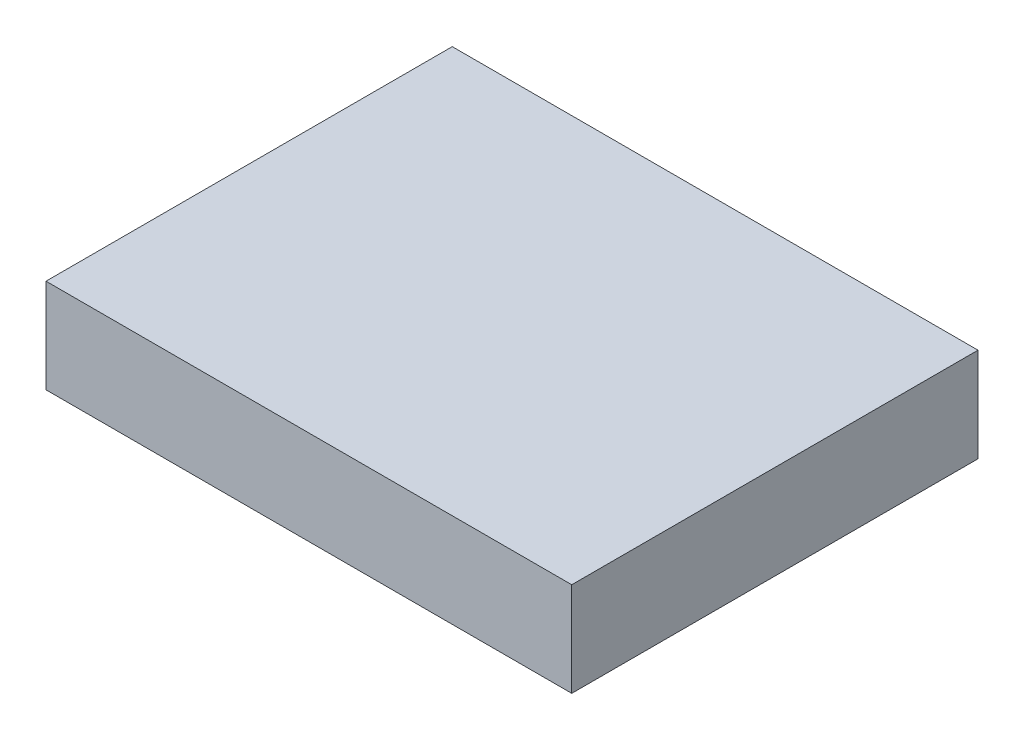
ISO-10303-21;
HEADER;
FILE_DESCRIPTION(('STEP AP214'),'2;1');
FILE_NAME('part.step','',(''),(''),'','','');
FILE_SCHEMA(('AUTOMOTIVE_DESIGN { 1 0 10303 214 1 1 1 1 }'));
ENDSEC;
DATA;
#1=APPLICATION_CONTEXT('core data for automotive mechanical design processes');
#2=APPLICATION_PROTOCOL_DEFINITION('international standard','automotive_design',2000,#1);
#3=PRODUCT_CONTEXT('',#1,'mechanical');
#4=PRODUCT('Part','Part','',(#3));
#5=PRODUCT_RELATED_PRODUCT_CATEGORY('part','',(#4));
#6=PRODUCT_DEFINITION_FORMATION('','',#4);
#7=PRODUCT_DEFINITION_CONTEXT('part definition',#1,'design');
#8=PRODUCT_DEFINITION('design','',#6,#7);
#9=PRODUCT_DEFINITION_SHAPE('','',#8);
#10=(LENGTH_UNIT() NAMED_UNIT(*) SI_UNIT(.MILLI.,.METRE.));
#11=(NAMED_UNIT(*) PLANE_ANGLE_UNIT() SI_UNIT($,.RADIAN.));
#12=(NAMED_UNIT(*) SI_UNIT($,.STERADIAN.) SOLID_ANGLE_UNIT());
#13=UNCERTAINTY_MEASURE_WITH_UNIT(LENGTH_MEASURE(1.E-05),#10,'distance_accuracy_value','');
#14=(GEOMETRIC_REPRESENTATION_CONTEXT(3) GLOBAL_UNCERTAINTY_ASSIGNED_CONTEXT((#13)) GLOBAL_UNIT_ASSIGNED_CONTEXT((#10,
#11,#12)) REPRESENTATION_CONTEXT('',''));
#15=CARTESIAN_POINT('',(0.,0.,0.));
#16=DIRECTION('',(0.,0.,1.));
#17=DIRECTION('',(1.,0.,0.));
#18=AXIS2_PLACEMENT_3D('',#15,#16,#17);
#19=CARTESIAN_POINT('',(139.7,50.,107.95));
#20=DIRECTION('',(-1.,0.,0.));
#21=DIRECTION('',(0.,0.,1.));
#22=AXIS2_PLACEMENT_3D('',#19,#20,#21);
#23=PLANE('',#22);
#24=DIRECTION('',(0.,0.,-1.));
#25=VECTOR('',#24,1.);
#26=CARTESIAN_POINT('',(139.7,0.,107.95));
#27=LINE('',#26,#25);
#28=CARTESIAN_POINT('',(139.7,0.,107.95));
#29=VERTEX_POINT('',#28);
#30=CARTESIAN_POINT('',(139.7,0.,-107.95));
#31=VERTEX_POINT('',#30);
#32=EDGE_CURVE('E99',#29,#31,#27,.T.);
#33=ORIENTED_EDGE('',*,*,#32,.T.);
#34=DIRECTION('',(0.,-1.,0.));
#35=VECTOR('',#34,1.);
#36=CARTESIAN_POINT('',(139.7,50.,-107.95));
#37=LINE('',#36,#35);
#38=CARTESIAN_POINT('',(139.7,50.,-107.95));
#39=VERTEX_POINT('',#38);
#40=EDGE_CURVE('E11',#39,#31,#37,.T.);
#41=ORIENTED_EDGE('',*,*,#40,.F.);
#42=DIRECTION('',(0.,0.,-1.));
#43=VECTOR('',#42,1.);
#44=CARTESIAN_POINT('',(139.7,50.,107.95));
#45=LINE('',#44,#43);
#46=CARTESIAN_POINT('',(139.7,50.,107.95));
#47=VERTEX_POINT('',#46);
#48=EDGE_CURVE('E87',#47,#39,#45,.T.);
#49=ORIENTED_EDGE('',*,*,#48,.F.);
#50=DIRECTION('',(0.,-1.,0.));
#51=VECTOR('',#50,1.);
#52=CARTESIAN_POINT('',(139.7,50.,107.95));
#53=LINE('',#52,#51);
#54=EDGE_CURVE('E95',#47,#29,#53,.T.);
#55=ORIENTED_EDGE('',*,*,#54,.T.);
#56=EDGE_LOOP('',(#33,#41,#49,#55));
#57=FACE_BOUND('',#56,.T.);
#58=ADVANCED_FACE('F36',(#57),#23,.F.);
#59=CARTESIAN_POINT('',(-139.7,50.,-107.95));
#60=DIRECTION('',(0.,0.,1.));
#61=DIRECTION('',(1.,0.,0.));
#62=AXIS2_PLACEMENT_3D('',#59,#60,#61);
#63=PLANE('',#62);
#64=DIRECTION('',(-1.,0.,0.));
#65=VECTOR('',#64,1.);
#66=CARTESIAN_POINT('',(-139.7,0.,-107.95));
#67=LINE('',#66,#65);
#68=CARTESIAN_POINT('',(-139.7,0.,-107.95));
#69=VERTEX_POINT('',#68);
#70=EDGE_CURVE('E91',#31,#69,#67,.T.);
#71=ORIENTED_EDGE('',*,*,#70,.T.);
#72=DIRECTION('',(0.,-1.,0.));
#73=VECTOR('',#72,1.);
#74=CARTESIAN_POINT('',(-139.7,50.,-107.95));
#75=LINE('',#74,#73);
#76=CARTESIAN_POINT('',(-139.7,50.,-107.95));
#77=VERTEX_POINT('',#76);
#78=EDGE_CURVE('E44',#77,#69,#75,.T.);
#79=ORIENTED_EDGE('',*,*,#78,.F.);
#80=DIRECTION('',(-1.,0.,0.));
#81=VECTOR('',#80,1.);
#82=CARTESIAN_POINT('',(-139.7,50.,-107.95));
#83=LINE('',#82,#81);
#84=EDGE_CURVE('E82',#39,#77,#83,.T.);
#85=ORIENTED_EDGE('',*,*,#84,.F.);
#86=ORIENTED_EDGE('',*,*,#40,.T.);
#87=EDGE_LOOP('',(#71,#79,#85,#86));
#88=FACE_BOUND('',#87,.T.);
#89=ADVANCED_FACE('F90',(#88),#63,.F.);
#90=CARTESIAN_POINT('',(-139.7,50.,107.95));
#91=DIRECTION('',(1.,0.,0.));
#92=DIRECTION('',(0.,0.,-1.));
#93=AXIS2_PLACEMENT_3D('',#90,#91,#92);
#94=PLANE('',#93);
#95=DIRECTION('',(0.,0.,1.));
#96=VECTOR('',#95,1.);
#97=CARTESIAN_POINT('',(-139.7,0.,107.95));
#98=LINE('',#97,#96);
#99=CARTESIAN_POINT('',(-139.7,0.,107.95));
#100=VERTEX_POINT('',#99);
#101=EDGE_CURVE('E69',#69,#100,#98,.T.);
#102=ORIENTED_EDGE('',*,*,#101,.T.);
#103=DIRECTION('',(0.,-1.,0.));
#104=VECTOR('',#103,1.);
#105=CARTESIAN_POINT('',(-139.7,50.,107.95));
#106=LINE('',#105,#104);
#107=CARTESIAN_POINT('',(-139.7,50.,107.95));
#108=VERTEX_POINT('',#107);
#109=EDGE_CURVE('E92',#108,#100,#106,.T.);
#110=ORIENTED_EDGE('',*,*,#109,.F.);
#111=DIRECTION('',(0.,0.,1.));
#112=VECTOR('',#111,1.);
#113=CARTESIAN_POINT('',(-139.7,50.,107.95));
#114=LINE('',#113,#112);
#115=EDGE_CURVE('E85',#77,#108,#114,.T.);
#116=ORIENTED_EDGE('',*,*,#115,.F.);
#117=ORIENTED_EDGE('',*,*,#78,.T.);
#118=EDGE_LOOP('',(#102,#110,#116,#117));
#119=FACE_BOUND('',#118,.T.);
#120=ADVANCED_FACE('F93',(#119),#94,.F.);
#121=CARTESIAN_POINT('',(-139.7,50.,107.95));
#122=DIRECTION('',(0.,0.,-1.));
#123=DIRECTION('',(-1.,0.,0.));
#124=AXIS2_PLACEMENT_3D('',#121,#122,#123);
#125=PLANE('',#124);
#126=DIRECTION('',(1.,0.,0.));
#127=VECTOR('',#126,1.);
#128=CARTESIAN_POINT('',(-139.7,0.,107.95));
#129=LINE('',#128,#127);
#130=EDGE_CURVE('E75',#100,#29,#129,.T.);
#131=ORIENTED_EDGE('',*,*,#130,.T.);
#132=ORIENTED_EDGE('',*,*,#54,.F.);
#133=DIRECTION('',(1.,0.,0.));
#134=VECTOR('',#133,1.);
#135=CARTESIAN_POINT('',(-139.7,50.,107.95));
#136=LINE('',#135,#134);
#137=EDGE_CURVE('E52',#108,#47,#136,.T.);
#138=ORIENTED_EDGE('',*,*,#137,.F.);
#139=ORIENTED_EDGE('',*,*,#109,.T.);
#140=EDGE_LOOP('',(#131,#132,#138,#139));
#141=FACE_BOUND('',#140,.T.);
#142=ADVANCED_FACE('F106',(#141),#125,.F.);
#143=CARTESIAN_POINT('',(0.,50.,0.));
#144=DIRECTION('',(0.,-1.,0.));
#145=DIRECTION('',(0.,0.,-1.));
#146=AXIS2_PLACEMENT_3D('',#143,#144,#145);
#147=PLANE('',#146);
#148=ORIENTED_EDGE('',*,*,#48,.T.);
#149=ORIENTED_EDGE('',*,*,#84,.T.);
#150=ORIENTED_EDGE('',*,*,#115,.T.);
#151=ORIENTED_EDGE('',*,*,#137,.T.);
#152=EDGE_LOOP('',(#148,#149,#150,#151));
#153=FACE_BOUND('',#152,.T.);
#154=ADVANCED_FACE('F83',(#153),#147,.F.);
#155=CARTESIAN_POINT('',(0.,0.,0.));
#156=DIRECTION('',(0.,-1.,0.));
#157=DIRECTION('',(0.,0.,-1.));
#158=AXIS2_PLACEMENT_3D('',#155,#156,#157);
#159=PLANE('',#158);
#160=ORIENTED_EDGE('',*,*,#32,.F.);
#161=ORIENTED_EDGE('',*,*,#130,.F.);
#162=ORIENTED_EDGE('',*,*,#101,.F.);
#163=ORIENTED_EDGE('',*,*,#70,.F.);
#164=EDGE_LOOP('',(#160,#161,#162,#163));
#165=FACE_BOUND('',#164,.T.);
#166=ADVANCED_FACE('F109',(#165),#159,.T.);
#167=CLOSED_SHELL('',(#58,#89,#120,#142,#154,#166));
#168=MANIFOLD_SOLID_BREP('B2',#167);
#169=ADVANCED_BREP_SHAPE_REPRESENTATION('',(#18,#168),#14);
#170=SHAPE_DEFINITION_REPRESENTATION(#9,#169);
ENDSEC;
END-ISO-10303-21;
